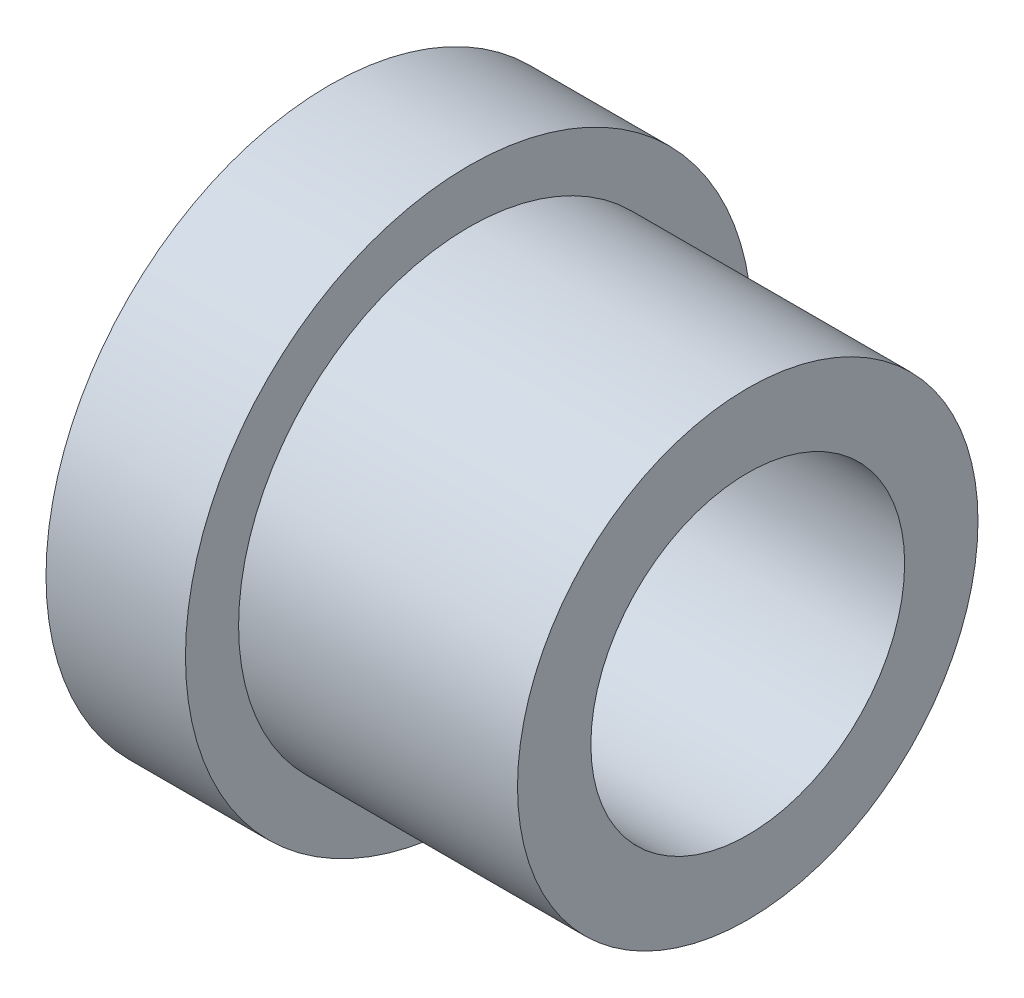
ISO-10303-21;
HEADER;
FILE_DESCRIPTION(('STEP AP214'),'2;1');
FILE_NAME('part.step','',(''),(''),'','','');
FILE_SCHEMA(('AUTOMOTIVE_DESIGN { 1 0 10303 214 1 1 1 1 }'));
ENDSEC;
DATA;
#1=APPLICATION_CONTEXT('core data for automotive mechanical design processes');
#2=APPLICATION_PROTOCOL_DEFINITION('international standard','automotive_design',2000,#1);
#3=PRODUCT_CONTEXT('',#1,'mechanical');
#4=PRODUCT('Part','Part','',(#3));
#5=PRODUCT_RELATED_PRODUCT_CATEGORY('part','',(#4));
#6=PRODUCT_DEFINITION_FORMATION('','',#4);
#7=PRODUCT_DEFINITION_CONTEXT('part definition',#1,'design');
#8=PRODUCT_DEFINITION('design','',#6,#7);
#9=PRODUCT_DEFINITION_SHAPE('','',#8);
#10=(LENGTH_UNIT() NAMED_UNIT(*) SI_UNIT(.MILLI.,.METRE.));
#11=(NAMED_UNIT(*) PLANE_ANGLE_UNIT() SI_UNIT($,.RADIAN.));
#12=(NAMED_UNIT(*) SI_UNIT($,.STERADIAN.) SOLID_ANGLE_UNIT());
#13=UNCERTAINTY_MEASURE_WITH_UNIT(LENGTH_MEASURE(1.E-05),#10,'distance_accuracy_value','');
#14=(GEOMETRIC_REPRESENTATION_CONTEXT(3) GLOBAL_UNCERTAINTY_ASSIGNED_CONTEXT((#13)) GLOBAL_UNIT_ASSIGNED_CONTEXT((#10,
#11,#12)) REPRESENTATION_CONTEXT('',''));
#15=CARTESIAN_POINT('',(0.,0.,0.));
#16=DIRECTION('',(0.,0.,1.));
#17=DIRECTION('',(1.,0.,0.));
#18=AXIS2_PLACEMENT_3D('',#15,#16,#17);
#19=CARTESIAN_POINT('',(0.,0.,0.));
#20=DIRECTION('',(-1.,0.,0.));
#21=DIRECTION('',(0.,0.,1.));
#22=AXIS2_PLACEMENT_3D('',#19,#20,#21);
#23=CYLINDRICAL_SURFACE('',#22,5.);
#24=CARTESIAN_POINT('',(12.,0.,0.));
#25=DIRECTION('',(-1.,0.,0.));
#26=DIRECTION('',(0.,0.,1.));
#27=AXIS2_PLACEMENT_3D('',#24,#25,#26);
#28=CIRCLE('',#27,5.);
#29=CARTESIAN_POINT('',(12.,0.,5.));
#30=VERTEX_POINT('',#29);
#31=EDGE_CURVE('E65',#30,#30,#28,.T.);
#32=ORIENTED_EDGE('',*,*,#31,.F.);
#33=EDGE_LOOP('',(#32));
#34=FACE_BOUND('',#33,.T.);
#35=CARTESIAN_POINT('',(0.,0.,0.));
#36=DIRECTION('',(-1.,0.,0.));
#37=DIRECTION('',(0.,0.,1.));
#38=AXIS2_PLACEMENT_3D('',#35,#36,#37);
#39=CIRCLE('',#38,5.);
#40=CARTESIAN_POINT('',(0.,0.,5.));
#41=VERTEX_POINT('',#40);
#42=EDGE_CURVE('E10',#41,#41,#39,.T.);
#43=ORIENTED_EDGE('',*,*,#42,.T.);
#44=EDGE_LOOP('',(#43));
#45=FACE_BOUND('',#44,.T.);
#46=ADVANCED_FACE('F31',(#34,#45),#23,.F.);
#47=CARTESIAN_POINT('',(0.,0.,-5.));
#48=DIRECTION('',(1.,0.,0.));
#49=DIRECTION('',(0.,0.,-1.));
#50=AXIS2_PLACEMENT_3D('',#47,#48,#49);
#51=PLANE('',#50);
#52=ORIENTED_EDGE('',*,*,#42,.F.);
#53=EDGE_LOOP('',(#52));
#54=FACE_BOUND('',#53,.T.);
#55=CARTESIAN_POINT('',(0.,0.,0.));
#56=DIRECTION('',(-1.,0.,0.));
#57=DIRECTION('',(0.,0.,1.));
#58=AXIS2_PLACEMENT_3D('',#55,#56,#57);
#59=CIRCLE('',#58,20.32);
#60=CARTESIAN_POINT('',(0.,0.,20.32));
#61=VERTEX_POINT('',#60);
#62=EDGE_CURVE('E37',#61,#61,#59,.T.);
#63=ORIENTED_EDGE('',*,*,#62,.T.);
#64=EDGE_LOOP('',(#63));
#65=FACE_BOUND('',#64,.T.);
#66=ADVANCED_FACE('F72',(#54,#65),#51,.F.);
#67=CARTESIAN_POINT('',(0.,0.,0.));
#68=DIRECTION('',(-1.,0.,0.));
#69=DIRECTION('',(0.,0.,1.));
#70=AXIS2_PLACEMENT_3D('',#67,#68,#69);
#71=CYLINDRICAL_SURFACE('',#70,20.32);
#72=ORIENTED_EDGE('',*,*,#62,.F.);
#73=EDGE_LOOP('',(#72));
#74=FACE_BOUND('',#73,.T.);
#75=CARTESIAN_POINT('',(10.,0.,0.));
#76=DIRECTION('',(-1.,0.,0.));
#77=DIRECTION('',(0.,0.,1.));
#78=AXIS2_PLACEMENT_3D('',#75,#76,#77);
#79=CIRCLE('',#78,20.32);
#80=CARTESIAN_POINT('',(10.,0.,20.32));
#81=VERTEX_POINT('',#80);
#82=EDGE_CURVE('E41',#81,#81,#79,.T.);
#83=ORIENTED_EDGE('',*,*,#82,.T.);
#84=EDGE_LOOP('',(#83));
#85=FACE_BOUND('',#84,.T.);
#86=ADVANCED_FACE('F76',(#74,#85),#71,.T.);
#87=CARTESIAN_POINT('',(10.,0.,-20.32));
#88=DIRECTION('',(-1.,0.,0.));
#89=DIRECTION('',(0.,0.,1.));
#90=AXIS2_PLACEMENT_3D('',#87,#88,#89);
#91=PLANE('',#90);
#92=ORIENTED_EDGE('',*,*,#82,.F.);
#93=EDGE_LOOP('',(#92));
#94=FACE_BOUND('',#93,.T.);
#95=CARTESIAN_POINT('',(10.,0.,0.));
#96=DIRECTION('',(-1.,0.,0.));
#97=DIRECTION('',(0.,0.,1.));
#98=AXIS2_PLACEMENT_3D('',#95,#96,#97);
#99=CIRCLE('',#98,16.51);
#100=CARTESIAN_POINT('',(10.,0.,16.51));
#101=VERTEX_POINT('',#100);
#102=EDGE_CURVE('E45',#101,#101,#99,.T.);
#103=ORIENTED_EDGE('',*,*,#102,.T.);
#104=EDGE_LOOP('',(#103));
#105=FACE_BOUND('',#104,.T.);
#106=ADVANCED_FACE('F81',(#94,#105),#91,.F.);
#107=CARTESIAN_POINT('',(0.,0.,0.));
#108=DIRECTION('',(-1.,0.,0.));
#109=DIRECTION('',(0.,0.,1.));
#110=AXIS2_PLACEMENT_3D('',#107,#108,#109);
#111=CYLINDRICAL_SURFACE('',#110,16.51);
#112=ORIENTED_EDGE('',*,*,#102,.F.);
#113=EDGE_LOOP('',(#112));
#114=FACE_BOUND('',#113,.T.);
#115=CARTESIAN_POINT('',(30.,0.,0.));
#116=DIRECTION('',(-1.,0.,0.));
#117=DIRECTION('',(0.,0.,1.));
#118=AXIS2_PLACEMENT_3D('',#115,#116,#117);
#119=CIRCLE('',#118,16.51);
#120=CARTESIAN_POINT('',(30.,0.,16.51));
#121=VERTEX_POINT('',#120);
#122=EDGE_CURVE('E50',#121,#121,#119,.T.);
#123=ORIENTED_EDGE('',*,*,#122,.T.);
#124=EDGE_LOOP('',(#123));
#125=FACE_BOUND('',#124,.T.);
#126=ADVANCED_FACE('F87',(#114,#125),#111,.T.);
#127=CARTESIAN_POINT('',(30.,0.,-16.51));
#128=DIRECTION('',(-1.,0.,0.));
#129=DIRECTION('',(0.,0.,1.));
#130=AXIS2_PLACEMENT_3D('',#127,#128,#129);
#131=PLANE('',#130);
#132=ORIENTED_EDGE('',*,*,#122,.F.);
#133=EDGE_LOOP('',(#132));
#134=FACE_BOUND('',#133,.T.);
#135=CARTESIAN_POINT('',(30.,0.,0.));
#136=DIRECTION('',(-1.,0.,0.));
#137=DIRECTION('',(0.,0.,1.));
#138=AXIS2_PLACEMENT_3D('',#135,#136,#137);
#139=CIRCLE('',#138,11.25);
#140=CARTESIAN_POINT('',(30.,0.,11.25));
#141=VERTEX_POINT('',#140);
#142=EDGE_CURVE('E53',#141,#141,#139,.T.);
#143=ORIENTED_EDGE('',*,*,#142,.T.);
#144=EDGE_LOOP('',(#143));
#145=FACE_BOUND('',#144,.T.);
#146=ADVANCED_FACE('F91',(#134,#145),#131,.F.);
#147=CARTESIAN_POINT('',(0.,0.,0.));
#148=DIRECTION('',(-1.,0.,0.));
#149=DIRECTION('',(0.,0.,1.));
#150=AXIS2_PLACEMENT_3D('',#147,#148,#149);
#151=CYLINDRICAL_SURFACE('',#150,11.25);
#152=ORIENTED_EDGE('',*,*,#142,.F.);
#153=EDGE_LOOP('',(#152));
#154=FACE_BOUND('',#153,.T.);
#155=CARTESIAN_POINT('',(13.5,0.,0.));
#156=DIRECTION('',(-1.,0.,0.));
#157=DIRECTION('',(0.,0.,1.));
#158=AXIS2_PLACEMENT_3D('',#155,#156,#157);
#159=CIRCLE('',#158,11.25);
#160=CARTESIAN_POINT('',(13.5,0.,11.25));
#161=VERTEX_POINT('',#160);
#162=EDGE_CURVE('E56',#161,#161,#159,.T.);
#163=ORIENTED_EDGE('',*,*,#162,.T.);
#164=EDGE_LOOP('',(#163));
#165=FACE_BOUND('',#164,.T.);
#166=ADVANCED_FACE('F95',(#154,#165),#151,.F.);
#167=CARTESIAN_POINT('',(13.5,0.,-11.25));
#168=DIRECTION('',(-1.,0.,0.));
#169=DIRECTION('',(0.,0.,1.));
#170=AXIS2_PLACEMENT_3D('',#167,#168,#169);
#171=PLANE('',#170);
#172=ORIENTED_EDGE('',*,*,#162,.F.);
#173=EDGE_LOOP('',(#172));
#174=FACE_BOUND('',#173,.T.);
#175=CARTESIAN_POINT('',(13.5,0.,0.));
#176=DIRECTION('',(-1.,0.,0.));
#177=DIRECTION('',(0.,0.,1.));
#178=AXIS2_PLACEMENT_3D('',#175,#176,#177);
#179=CIRCLE('',#178,8.6);
#180=CARTESIAN_POINT('',(13.5,0.,8.6));
#181=VERTEX_POINT('',#180);
#182=EDGE_CURVE('E59',#181,#181,#179,.T.);
#183=ORIENTED_EDGE('',*,*,#182,.T.);
#184=EDGE_LOOP('',(#183));
#185=FACE_BOUND('',#184,.T.);
#186=ADVANCED_FACE('F99',(#174,#185),#171,.F.);
#187=CARTESIAN_POINT('',(0.,0.,0.));
#188=DIRECTION('',(-1.,0.,0.));
#189=DIRECTION('',(0.,0.,1.));
#190=AXIS2_PLACEMENT_3D('',#187,#188,#189);
#191=CYLINDRICAL_SURFACE('',#190,8.6);
#192=ORIENTED_EDGE('',*,*,#182,.F.);
#193=EDGE_LOOP('',(#192));
#194=FACE_BOUND('',#193,.T.);
#195=CARTESIAN_POINT('',(12.,0.,0.));
#196=DIRECTION('',(-1.,0.,0.));
#197=DIRECTION('',(0.,0.,1.));
#198=AXIS2_PLACEMENT_3D('',#195,#196,#197);
#199=CIRCLE('',#198,8.6);
#200=CARTESIAN_POINT('',(12.,0.,8.6));
#201=VERTEX_POINT('',#200);
#202=EDGE_CURVE('E62',#201,#201,#199,.T.);
#203=ORIENTED_EDGE('',*,*,#202,.T.);
#204=EDGE_LOOP('',(#203));
#205=FACE_BOUND('',#204,.T.);
#206=ADVANCED_FACE('F103',(#194,#205),#191,.F.);
#207=CARTESIAN_POINT('',(12.,0.,-8.6));
#208=DIRECTION('',(-1.,0.,0.));
#209=DIRECTION('',(0.,0.,1.));
#210=AXIS2_PLACEMENT_3D('',#207,#208,#209);
#211=PLANE('',#210);
#212=ORIENTED_EDGE('',*,*,#202,.F.);
#213=EDGE_LOOP('',(#212));
#214=FACE_BOUND('',#213,.T.);
#215=ORIENTED_EDGE('',*,*,#31,.T.);
#216=EDGE_LOOP('',(#215));
#217=FACE_BOUND('',#216,.T.);
#218=ADVANCED_FACE('F69',(#214,#217),#211,.F.);
#219=CLOSED_SHELL('',(#46,#66,#86,#106,#126,#146,#166,#186,#206,#218));
#220=MANIFOLD_SOLID_BREP('B2',#219);
#221=ADVANCED_BREP_SHAPE_REPRESENTATION('',(#18,#220),#14);
#222=SHAPE_DEFINITION_REPRESENTATION(#9,#221);
ENDSEC;
END-ISO-10303-21;
